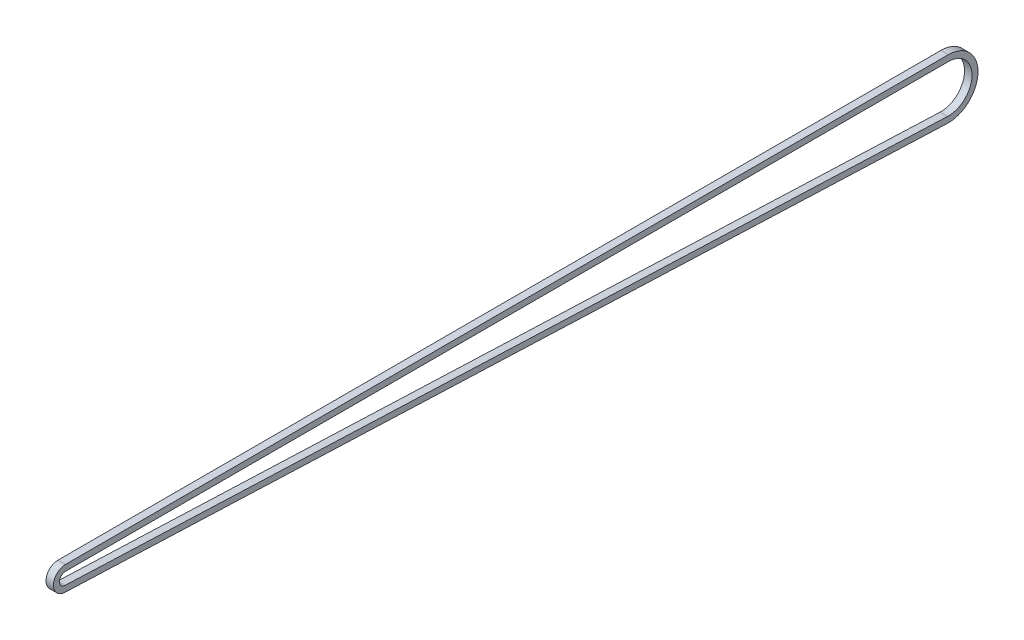
ISO-10303-21;
HEADER;
FILE_DESCRIPTION(('STEP AP214'),'2;1');
FILE_NAME('part.step','',(''),(''),'','','');
FILE_SCHEMA(('AUTOMOTIVE_DESIGN { 1 0 10303 214 1 1 1 1 }'));
ENDSEC;
DATA;
#1=APPLICATION_CONTEXT('core data for automotive mechanical design processes');
#2=APPLICATION_PROTOCOL_DEFINITION('international standard','automotive_design',2000,#1);
#3=PRODUCT_CONTEXT('',#1,'mechanical');
#4=PRODUCT('Part','Part','',(#3));
#5=PRODUCT_RELATED_PRODUCT_CATEGORY('part','',(#4));
#6=PRODUCT_DEFINITION_FORMATION('','',#4);
#7=PRODUCT_DEFINITION_CONTEXT('part definition',#1,'design');
#8=PRODUCT_DEFINITION('design','',#6,#7);
#9=PRODUCT_DEFINITION_SHAPE('','',#8);
#10=(LENGTH_UNIT() NAMED_UNIT(*) SI_UNIT(.MILLI.,.METRE.));
#11=(NAMED_UNIT(*) PLANE_ANGLE_UNIT() SI_UNIT($,.RADIAN.));
#12=(NAMED_UNIT(*) SI_UNIT($,.STERADIAN.) SOLID_ANGLE_UNIT());
#13=UNCERTAINTY_MEASURE_WITH_UNIT(LENGTH_MEASURE(1.E-05),#10,'distance_accuracy_value','');
#14=(GEOMETRIC_REPRESENTATION_CONTEXT(3) GLOBAL_UNCERTAINTY_ASSIGNED_CONTEXT((#13)) GLOBAL_UNIT_ASSIGNED_CONTEXT((#10,
#11,#12)) REPRESENTATION_CONTEXT('',''));
#15=CARTESIAN_POINT('',(0.,0.,0.));
#16=DIRECTION('',(0.,0.,1.));
#17=DIRECTION('',(1.,0.,0.));
#18=AXIS2_PLACEMENT_3D('',#15,#16,#17);
#19=CARTESIAN_POINT('',(5.,-7.99366737182493,0.318248249989743));
#20=DIRECTION('',(0.,0.999208421478116,-0.0397810312487178));
#21=DIRECTION('',(0.,0.0397810312487178,0.999208421478116));
#22=AXIS2_PLACEMENT_3D('',#19,#20,#21);
#23=PLANE('',#22);
#24=DIRECTION('',(0.,-0.0397810312487178,-0.999208421478116));
#25=VECTOR('',#24,1.);
#26=CARTESIAN_POINT('',(0.,-7.99366737182493,0.318248249989743));
#27=LINE('',#26,#25);
#28=CARTESIAN_POINT('',(0.,-7.99366737182493,0.318248249989742));
#29=VERTEX_POINT('',#28);
#30=CARTESIAN_POINT('',(0.,-31.4843663241928,-589.714324632838));
#31=VERTEX_POINT('',#30);
#32=EDGE_CURVE('E143',#29,#31,#27,.T.);
#33=ORIENTED_EDGE('',*,*,#32,.T.);
#34=DIRECTION('',(-1.,0.,0.));
#35=VECTOR('',#34,1.);
#36=CARTESIAN_POINT('',(5.,-31.4843663241928,-589.714324632838));
#37=LINE('',#36,#35);
#38=CARTESIAN_POINT('',(5.,-31.4843663241928,-589.714324632838));
#39=VERTEX_POINT('',#38);
#40=EDGE_CURVE('E11',#39,#31,#37,.T.);
#41=ORIENTED_EDGE('',*,*,#40,.F.);
#42=DIRECTION('',(0.,-0.0397810312487178,-0.999208421478116));
#43=VECTOR('',#42,1.);
#44=CARTESIAN_POINT('',(5.,-7.99366737182493,0.318248249989743));
#45=LINE('',#44,#43);
#46=CARTESIAN_POINT('',(5.,-7.99366737182493,0.318248249989742));
#47=VERTEX_POINT('',#46);
#48=EDGE_CURVE('E114',#47,#39,#45,.T.);
#49=ORIENTED_EDGE('',*,*,#48,.F.);
#50=DIRECTION('',(-1.,0.,0.));
#51=VECTOR('',#50,1.);
#52=CARTESIAN_POINT('',(5.,-7.99366737182493,0.318248249989742));
#53=LINE('',#52,#51);
#54=EDGE_CURVE('E151',#47,#29,#53,.T.);
#55=ORIENTED_EDGE('',*,*,#54,.T.);
#56=EDGE_LOOP('',(#33,#41,#49,#55));
#57=FACE_BOUND('',#56,.T.);
#58=ADVANCED_FACE('F37',(#57),#23,.F.);
#59=CARTESIAN_POINT('',(5.,-11.75,-590.5));
#60=DIRECTION('',(-1.,0.,0.));
#61=DIRECTION('',(0.,0.,1.));
#62=AXIS2_PLACEMENT_3D('',#59,#60,#61);
#63=CYLINDRICAL_SURFACE('',#62,19.75);
#64=CARTESIAN_POINT('',(0.,-11.75,-590.5));
#65=DIRECTION('',(1.,0.,0.));
#66=DIRECTION('',(0.,0.,-1.));
#67=AXIS2_PLACEMENT_3D('',#64,#65,#66);
#68=CIRCLE('',#67,19.75);
#69=CARTESIAN_POINT('',(0.,8.,-590.5));
#70=VERTEX_POINT('',#69);
#71=EDGE_CURVE('E120',#31,#70,#68,.T.);
#72=ORIENTED_EDGE('',*,*,#71,.T.);
#73=DIRECTION('',(-1.,0.,0.));
#74=VECTOR('',#73,1.);
#75=CARTESIAN_POINT('',(5.,8.,-590.5));
#76=LINE('',#75,#74);
#77=CARTESIAN_POINT('',(5.,8.,-590.5));
#78=VERTEX_POINT('',#77);
#79=EDGE_CURVE('E47',#78,#70,#76,.T.);
#80=ORIENTED_EDGE('',*,*,#79,.F.);
#81=CARTESIAN_POINT('',(5.,-11.75,-590.5));
#82=DIRECTION('',(1.,0.,0.));
#83=DIRECTION('',(0.,0.,-1.));
#84=AXIS2_PLACEMENT_3D('',#81,#82,#83);
#85=CIRCLE('',#84,19.75);
#86=EDGE_CURVE('E108',#39,#78,#85,.T.);
#87=ORIENTED_EDGE('',*,*,#86,.F.);
#88=ORIENTED_EDGE('',*,*,#40,.T.);
#89=EDGE_LOOP('',(#72,#80,#87,#88));
#90=FACE_BOUND('',#89,.T.);
#91=ADVANCED_FACE('F119',(#90),#63,.T.);
#92=CARTESIAN_POINT('',(5.,8.,0.));
#93=DIRECTION('',(0.,1.,0.));
#94=DIRECTION('',(0.,0.,1.));
#95=AXIS2_PLACEMENT_3D('',#92,#93,#94);
#96=PLANE('',#95);
#97=DIRECTION('',(0.,0.,-1.));
#98=VECTOR('',#97,1.);
#99=CARTESIAN_POINT('',(0.,8.,0.));
#100=LINE('',#99,#98);
#101=CARTESIAN_POINT('',(0.,8.,0.));
#102=VERTEX_POINT('',#101);
#103=EDGE_CURVE('E147',#102,#70,#100,.T.);
#104=ORIENTED_EDGE('',*,*,#103,.F.);
#105=DIRECTION('',(-1.,0.,0.));
#106=VECTOR('',#105,1.);
#107=CARTESIAN_POINT('',(5.,8.,0.));
#108=LINE('',#107,#106);
#109=CARTESIAN_POINT('',(5.,8.,0.));
#110=VERTEX_POINT('',#109);
#111=EDGE_CURVE('E84',#110,#102,#108,.T.);
#112=ORIENTED_EDGE('',*,*,#111,.F.);
#113=DIRECTION('',(0.,0.,-1.));
#114=VECTOR('',#113,1.);
#115=CARTESIAN_POINT('',(5.,8.,0.));
#116=LINE('',#115,#114);
#117=EDGE_CURVE('E112',#110,#78,#116,.T.);
#118=ORIENTED_EDGE('',*,*,#117,.T.);
#119=ORIENTED_EDGE('',*,*,#79,.T.);
#120=EDGE_LOOP('',(#104,#112,#118,#119));
#121=FACE_BOUND('',#120,.T.);
#122=ADVANCED_FACE('F125',(#121),#96,.T.);
#123=CARTESIAN_POINT('',(5.,0.,0.));
#124=DIRECTION('',(-1.,0.,0.));
#125=DIRECTION('',(0.,0.,1.));
#126=AXIS2_PLACEMENT_3D('',#123,#124,#125);
#127=CYLINDRICAL_SURFACE('',#126,4.);
#128=CARTESIAN_POINT('',(0.,0.,0.));
#129=DIRECTION('',(1.,0.,0.));
#130=DIRECTION('',(0.,0.,-1.));
#131=AXIS2_PLACEMENT_3D('',#128,#129,#130);
#132=CIRCLE('',#131,4.);
#133=CARTESIAN_POINT('',(0.,4.,0.));
#134=VERTEX_POINT('',#133);
#135=CARTESIAN_POINT('',(0.,-3.99683368591246,0.159124124994871));
#136=VERTEX_POINT('',#135);
#137=EDGE_CURVE('E131',#134,#136,#132,.T.);
#138=ORIENTED_EDGE('',*,*,#137,.F.);
#139=DIRECTION('',(-1.,0.,0.));
#140=VECTOR('',#139,1.);
#141=CARTESIAN_POINT('',(5.,4.,0.));
#142=LINE('',#141,#140);
#143=CARTESIAN_POINT('',(5.,4.,0.));
#144=VERTEX_POINT('',#143);
#145=EDGE_CURVE('E41',#144,#134,#142,.T.);
#146=ORIENTED_EDGE('',*,*,#145,.F.);
#147=CARTESIAN_POINT('',(5.,0.,0.));
#148=DIRECTION('',(1.,0.,0.));
#149=DIRECTION('',(0.,0.,-1.));
#150=AXIS2_PLACEMENT_3D('',#147,#148,#149);
#151=CIRCLE('',#150,4.);
#152=CARTESIAN_POINT('',(5.,-3.99683368591246,0.159124124994871));
#153=VERTEX_POINT('',#152);
#154=EDGE_CURVE('E150',#144,#153,#151,.T.);
#155=ORIENTED_EDGE('',*,*,#154,.T.);
#156=DIRECTION('',(-1.,0.,0.));
#157=VECTOR('',#156,1.);
#158=CARTESIAN_POINT('',(5.,-3.99683368591246,0.159124124994871));
#159=LINE('',#158,#157);
#160=EDGE_CURVE('E127',#153,#136,#159,.T.);
#161=ORIENTED_EDGE('',*,*,#160,.T.);
#162=EDGE_LOOP('',(#138,#146,#155,#161));
#163=FACE_BOUND('',#162,.T.);
#164=ADVANCED_FACE('F39',(#163),#127,.F.);
#165=CARTESIAN_POINT('',(5.,4.,0.));
#166=DIRECTION('',(0.,1.,0.));
#167=DIRECTION('',(0.,0.,1.));
#168=AXIS2_PLACEMENT_3D('',#165,#166,#167);
#169=PLANE('',#168);
#170=DIRECTION('',(0.,0.,-1.));
#171=VECTOR('',#170,1.);
#172=CARTESIAN_POINT('',(0.,4.,0.));
#173=LINE('',#172,#171);
#174=CARTESIAN_POINT('',(0.,4.,-590.5));
#175=VERTEX_POINT('',#174);
#176=EDGE_CURVE('E134',#134,#175,#173,.T.);
#177=ORIENTED_EDGE('',*,*,#176,.T.);
#178=DIRECTION('',(-1.,0.,0.));
#179=VECTOR('',#178,1.);
#180=CARTESIAN_POINT('',(5.,4.,-590.5));
#181=LINE('',#180,#179);
#182=CARTESIAN_POINT('',(5.,4.,-590.5));
#183=VERTEX_POINT('',#182);
#184=EDGE_CURVE('E156',#183,#175,#181,.T.);
#185=ORIENTED_EDGE('',*,*,#184,.F.);
#186=DIRECTION('',(0.,0.,-1.));
#187=VECTOR('',#186,1.);
#188=CARTESIAN_POINT('',(5.,4.,0.));
#189=LINE('',#188,#187);
#190=EDGE_CURVE('E164',#144,#183,#189,.T.);
#191=ORIENTED_EDGE('',*,*,#190,.F.);
#192=ORIENTED_EDGE('',*,*,#145,.T.);
#193=EDGE_LOOP('',(#177,#185,#191,#192));
#194=FACE_BOUND('',#193,.T.);
#195=ADVANCED_FACE('F163',(#194),#169,.F.);
#196=CARTESIAN_POINT('',(5.,-11.75,-590.5));
#197=DIRECTION('',(-1.,0.,0.));
#198=DIRECTION('',(0.,0.,1.));
#199=AXIS2_PLACEMENT_3D('',#196,#197,#198);
#200=CYLINDRICAL_SURFACE('',#199,15.7500000000001);
#201=CARTESIAN_POINT('',(0.,-11.75,-590.5));
#202=DIRECTION('',(1.,0.,0.));
#203=DIRECTION('',(0.,0.,-1.));
#204=AXIS2_PLACEMENT_3D('',#201,#202,#203);
#205=CIRCLE('',#204,15.7500000000001);
#206=CARTESIAN_POINT('',(0.,-27.4875326382803,-589.873448757833));
#207=VERTEX_POINT('',#206);
#208=EDGE_CURVE('E137',#207,#175,#205,.T.);
#209=ORIENTED_EDGE('',*,*,#208,.F.);
#210=DIRECTION('',(-1.,0.,0.));
#211=VECTOR('',#210,1.);
#212=CARTESIAN_POINT('',(5.,-27.4875326382803,-589.873448757833));
#213=LINE('',#212,#211);
#214=CARTESIAN_POINT('',(5.,-27.4875326382803,-589.873448757833));
#215=VERTEX_POINT('',#214);
#216=EDGE_CURVE('E155',#215,#207,#213,.T.);
#217=ORIENTED_EDGE('',*,*,#216,.F.);
#218=CARTESIAN_POINT('',(5.,-11.75,-590.5));
#219=DIRECTION('',(1.,0.,0.));
#220=DIRECTION('',(0.,0.,-1.));
#221=AXIS2_PLACEMENT_3D('',#218,#219,#220);
#222=CIRCLE('',#221,15.7500000000001);
#223=EDGE_CURVE('E176',#215,#183,#222,.T.);
#224=ORIENTED_EDGE('',*,*,#223,.T.);
#225=ORIENTED_EDGE('',*,*,#184,.T.);
#226=EDGE_LOOP('',(#209,#217,#224,#225));
#227=FACE_BOUND('',#226,.T.);
#228=ADVANCED_FACE('F174',(#227),#200,.F.);
#229=CARTESIAN_POINT('',(5.,-3.99683368591246,0.159124124994871));
#230=DIRECTION('',(0.,-0.999208421478116,0.0397810312487178));
#231=DIRECTION('',(0.,-0.0397810312487178,-0.999208421478116));
#232=AXIS2_PLACEMENT_3D('',#229,#230,#231);
#233=PLANE('',#232);
#234=DIRECTION('',(0.,0.0397810312487178,0.999208421478116));
#235=VECTOR('',#234,1.);
#236=CARTESIAN_POINT('',(0.,-3.99683368591246,0.159124124994871));
#237=LINE('',#236,#235);
#238=EDGE_CURVE('E140',#207,#136,#237,.T.);
#239=ORIENTED_EDGE('',*,*,#238,.T.);
#240=ORIENTED_EDGE('',*,*,#160,.F.);
#241=DIRECTION('',(0.,0.0397810312487178,0.999208421478116));
#242=VECTOR('',#241,1.);
#243=CARTESIAN_POINT('',(5.,-3.99683368591246,0.159124124994871));
#244=LINE('',#243,#242);
#245=EDGE_CURVE('E177',#215,#153,#244,.T.);
#246=ORIENTED_EDGE('',*,*,#245,.F.);
#247=ORIENTED_EDGE('',*,*,#216,.T.);
#248=EDGE_LOOP('',(#239,#240,#246,#247));
#249=FACE_BOUND('',#248,.T.);
#250=ADVANCED_FACE('F173',(#249),#233,.F.);
#251=CARTESIAN_POINT('',(5.,0.,0.));
#252=DIRECTION('',(-1.,0.,0.));
#253=DIRECTION('',(0.,0.,1.));
#254=AXIS2_PLACEMENT_3D('',#251,#252,#253);
#255=CYLINDRICAL_SURFACE('',#254,8.);
#256=CARTESIAN_POINT('',(0.,0.,0.));
#257=DIRECTION('',(1.,0.,0.));
#258=DIRECTION('',(0.,0.,-1.));
#259=AXIS2_PLACEMENT_3D('',#256,#257,#258);
#260=CIRCLE('',#259,8.);
#261=EDGE_CURVE('E87',#102,#29,#260,.T.);
#262=ORIENTED_EDGE('',*,*,#261,.T.);
#263=ORIENTED_EDGE('',*,*,#54,.F.);
#264=CARTESIAN_POINT('',(5.,0.,0.));
#265=DIRECTION('',(1.,0.,0.));
#266=DIRECTION('',(0.,0.,-1.));
#267=AXIS2_PLACEMENT_3D('',#264,#265,#266);
#268=CIRCLE('',#267,8.);
#269=EDGE_CURVE('E56',#110,#47,#268,.T.);
#270=ORIENTED_EDGE('',*,*,#269,.F.);
#271=ORIENTED_EDGE('',*,*,#111,.T.);
#272=EDGE_LOOP('',(#262,#263,#270,#271));
#273=FACE_BOUND('',#272,.T.);
#274=ADVANCED_FACE('F184',(#273),#255,.T.);
#275=CARTESIAN_POINT('',(5.,0.,0.));
#276=DIRECTION('',(1.,0.,0.));
#277=DIRECTION('',(0.,0.,-1.));
#278=AXIS2_PLACEMENT_3D('',#275,#276,#277);
#279=PLANE('',#278);
#280=ORIENTED_EDGE('',*,*,#154,.F.);
#281=ORIENTED_EDGE('',*,*,#190,.T.);
#282=ORIENTED_EDGE('',*,*,#223,.F.);
#283=ORIENTED_EDGE('',*,*,#245,.T.);
#284=EDGE_LOOP('',(#280,#281,#282,#283));
#285=FACE_BOUND('',#284,.T.);
#286=ORIENTED_EDGE('',*,*,#48,.T.);
#287=ORIENTED_EDGE('',*,*,#86,.T.);
#288=ORIENTED_EDGE('',*,*,#117,.F.);
#289=ORIENTED_EDGE('',*,*,#269,.T.);
#290=EDGE_LOOP('',(#286,#287,#288,#289));
#291=FACE_BOUND('',#290,.T.);
#292=ADVANCED_FACE('F110',(#285,#291),#279,.T.);
#293=CARTESIAN_POINT('',(0.,0.,0.));
#294=DIRECTION('',(1.,0.,0.));
#295=DIRECTION('',(0.,0.,-1.));
#296=AXIS2_PLACEMENT_3D('',#293,#294,#295);
#297=PLANE('',#296);
#298=ORIENTED_EDGE('',*,*,#137,.T.);
#299=ORIENTED_EDGE('',*,*,#238,.F.);
#300=ORIENTED_EDGE('',*,*,#208,.T.);
#301=ORIENTED_EDGE('',*,*,#176,.F.);
#302=EDGE_LOOP('',(#298,#299,#300,#301));
#303=FACE_BOUND('',#302,.T.);
#304=ORIENTED_EDGE('',*,*,#32,.F.);
#305=ORIENTED_EDGE('',*,*,#261,.F.);
#306=ORIENTED_EDGE('',*,*,#103,.T.);
#307=ORIENTED_EDGE('',*,*,#71,.F.);
#308=EDGE_LOOP('',(#304,#305,#306,#307));
#309=FACE_BOUND('',#308,.T.);
#310=ADVANCED_FACE('F167',(#303,#309),#297,.F.);
#311=CLOSED_SHELL('',(#58,#91,#122,#164,#195,#228,#250,#274,#292,#310));
#312=MANIFOLD_SOLID_BREP('B2',#311);
#313=ADVANCED_BREP_SHAPE_REPRESENTATION('',(#18,#312),#14);
#314=SHAPE_DEFINITION_REPRESENTATION(#9,#313);
ENDSEC;
END-ISO-10303-21;
